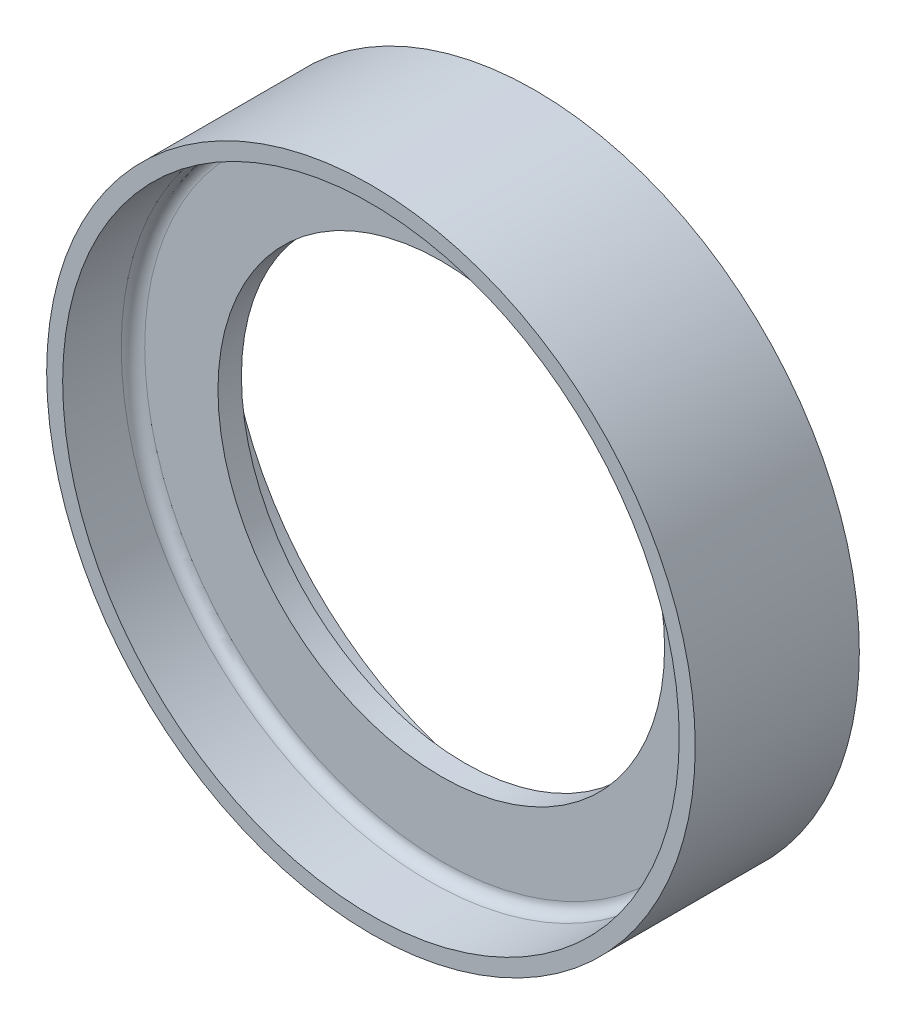
ISO-10303-21;
HEADER;
FILE_DESCRIPTION(('STEP AP214'),'2;1');
FILE_NAME('part.step','',(''),(''),'','','');
FILE_SCHEMA(('AUTOMOTIVE_DESIGN { 1 0 10303 214 1 1 1 1 }'));
ENDSEC;
DATA;
#1=APPLICATION_CONTEXT('core data for automotive mechanical design processes');
#2=APPLICATION_PROTOCOL_DEFINITION('international standard','automotive_design',2000,#1);
#3=PRODUCT_CONTEXT('',#1,'mechanical');
#4=PRODUCT('Part','Part','',(#3));
#5=PRODUCT_RELATED_PRODUCT_CATEGORY('part','',(#4));
#6=PRODUCT_DEFINITION_FORMATION('','',#4);
#7=PRODUCT_DEFINITION_CONTEXT('part definition',#1,'design');
#8=PRODUCT_DEFINITION('design','',#6,#7);
#9=PRODUCT_DEFINITION_SHAPE('','',#8);
#10=(LENGTH_UNIT() NAMED_UNIT(*) SI_UNIT(.MILLI.,.METRE.));
#11=(NAMED_UNIT(*) PLANE_ANGLE_UNIT() SI_UNIT($,.RADIAN.));
#12=(NAMED_UNIT(*) SI_UNIT($,.STERADIAN.) SOLID_ANGLE_UNIT());
#13=UNCERTAINTY_MEASURE_WITH_UNIT(LENGTH_MEASURE(1.E-05),#10,'distance_accuracy_value','');
#14=(GEOMETRIC_REPRESENTATION_CONTEXT(3) GLOBAL_UNCERTAINTY_ASSIGNED_CONTEXT((#13)) GLOBAL_UNIT_ASSIGNED_CONTEXT((#10,
#11,#12)) REPRESENTATION_CONTEXT('',''));
#15=CARTESIAN_POINT('',(0.,0.,0.));
#16=DIRECTION('',(0.,0.,1.));
#17=DIRECTION('',(1.,0.,0.));
#18=AXIS2_PLACEMENT_3D('',#15,#16,#17);
#19=CARTESIAN_POINT('',(0.,0.,1.));
#20=DIRECTION('',(0.,0.,1.));
#21=DIRECTION('',(1.,0.,0.));
#22=AXIS2_PLACEMENT_3D('',#19,#20,#21);
#23=PLANE('',#22);
#24=CARTESIAN_POINT('',(0.,0.,1.));
#25=DIRECTION('',(0.,0.,1.));
#26=DIRECTION('',(1.,0.,0.));
#27=AXIS2_PLACEMENT_3D('',#24,#25,#26);
#28=CIRCLE('',#27,12.65);
#29=CARTESIAN_POINT('',(12.65,0.,1.));
#30=VERTEX_POINT('',#29);
#31=EDGE_CURVE('E10',#30,#30,#28,.T.);
#32=ORIENTED_EDGE('',*,*,#31,.T.);
#33=EDGE_LOOP('',(#32));
#34=FACE_BOUND('',#33,.T.);
#35=CARTESIAN_POINT('',(0.,0.,1.));
#36=DIRECTION('',(0.,0.,1.));
#37=DIRECTION('',(1.,0.,0.));
#38=AXIS2_PLACEMENT_3D('',#35,#36,#37);
#39=CIRCLE('',#38,9.525);
#40=CARTESIAN_POINT('',(9.525,0.,1.));
#41=VERTEX_POINT('',#40);
#42=EDGE_CURVE('E57',#41,#41,#39,.T.);
#43=ORIENTED_EDGE('',*,*,#42,.F.);
#44=EDGE_LOOP('',(#43));
#45=FACE_BOUND('',#44,.T.);
#46=ADVANCED_FACE('F31',(#34,#45),#23,.T.);
#47=CARTESIAN_POINT('',(0.,0.,-3.));
#48=DIRECTION('',(0.,0.,1.));
#49=DIRECTION('',(1.,0.,0.));
#50=AXIS2_PLACEMENT_3D('',#47,#48,#49);
#51=CYLINDRICAL_SURFACE('',#50,13.8327);
#52=CARTESIAN_POINT('',(0.,0.,-3.));
#53=DIRECTION('',(0.,0.,1.));
#54=DIRECTION('',(1.,0.,0.));
#55=AXIS2_PLACEMENT_3D('',#52,#53,#54);
#56=CIRCLE('',#55,13.8327);
#57=CARTESIAN_POINT('',(13.8327,0.,-3.));
#58=VERTEX_POINT('',#57);
#59=EDGE_CURVE('E51',#58,#58,#56,.T.);
#60=ORIENTED_EDGE('',*,*,#59,.T.);
#61=EDGE_LOOP('',(#60));
#62=FACE_BOUND('',#61,.T.);
#63=CARTESIAN_POINT('',(0.,0.,4.));
#64=DIRECTION('',(0.,0.,1.));
#65=DIRECTION('',(1.,0.,0.));
#66=AXIS2_PLACEMENT_3D('',#63,#64,#65);
#67=CIRCLE('',#66,13.8327);
#68=CARTESIAN_POINT('',(13.8327,0.,4.));
#69=VERTEX_POINT('',#68);
#70=EDGE_CURVE('E61',#69,#69,#67,.T.);
#71=ORIENTED_EDGE('',*,*,#70,.F.);
#72=EDGE_LOOP('',(#71));
#73=FACE_BOUND('',#72,.T.);
#74=ADVANCED_FACE('F87',(#62,#73),#51,.T.);
#75=CARTESIAN_POINT('',(0.,0.,-3.));
#76=DIRECTION('',(0.,0.,1.));
#77=DIRECTION('',(1.,0.,0.));
#78=AXIS2_PLACEMENT_3D('',#75,#76,#77);
#79=PLANE('',#78);
#80=CARTESIAN_POINT('',(0.,0.,-3.));
#81=DIRECTION('',(0.,0.,1.));
#82=DIRECTION('',(1.,0.,0.));
#83=AXIS2_PLACEMENT_3D('',#80,#81,#82);
#84=CIRCLE('',#83,13.15);
#85=CARTESIAN_POINT('',(13.15,0.,-3.));
#86=VERTEX_POINT('',#85);
#87=EDGE_CURVE('E54',#86,#86,#84,.T.);
#88=ORIENTED_EDGE('',*,*,#87,.T.);
#89=EDGE_LOOP('',(#88));
#90=FACE_BOUND('',#89,.T.);
#91=ORIENTED_EDGE('',*,*,#59,.F.);
#92=EDGE_LOOP('',(#91));
#93=FACE_BOUND('',#92,.T.);
#94=ADVANCED_FACE('F92',(#90,#93),#79,.F.);
#95=CARTESIAN_POINT('',(0.,0.,-3.));
#96=DIRECTION('',(0.,0.,1.));
#97=DIRECTION('',(1.,0.,0.));
#98=AXIS2_PLACEMENT_3D('',#95,#96,#97);
#99=CYLINDRICAL_SURFACE('',#98,13.15);
#100=CARTESIAN_POINT('',(0.,0.,-0.5));
#101=DIRECTION('',(0.,0.,1.));
#102=DIRECTION('',(1.,0.,0.));
#103=AXIS2_PLACEMENT_3D('',#100,#101,#102);
#104=CIRCLE('',#103,13.15);
#105=CARTESIAN_POINT('',(13.15,0.,-0.5));
#106=VERTEX_POINT('',#105);
#107=EDGE_CURVE('E46',#106,#106,#104,.T.);
#108=ORIENTED_EDGE('',*,*,#107,.T.);
#109=EDGE_LOOP('',(#108));
#110=FACE_BOUND('',#109,.T.);
#111=ORIENTED_EDGE('',*,*,#87,.F.);
#112=EDGE_LOOP('',(#111));
#113=FACE_BOUND('',#112,.T.);
#114=ADVANCED_FACE('F99',(#110,#113),#99,.F.);
#115=CARTESIAN_POINT('',(0.,0.,0.));
#116=DIRECTION('',(0.,0.,1.));
#117=DIRECTION('',(1.,0.,0.));
#118=AXIS2_PLACEMENT_3D('',#115,#116,#117);
#119=PLANE('',#118);
#120=CARTESIAN_POINT('',(0.,0.,0.));
#121=DIRECTION('',(0.,0.,1.));
#122=DIRECTION('',(1.,0.,0.));
#123=AXIS2_PLACEMENT_3D('',#120,#121,#122);
#124=CIRCLE('',#123,12.65);
#125=CARTESIAN_POINT('',(12.65,0.,0.));
#126=VERTEX_POINT('',#125);
#127=EDGE_CURVE('E42',#126,#126,#124,.F.);
#128=ORIENTED_EDGE('',*,*,#127,.T.);
#129=EDGE_LOOP('',(#128));
#130=FACE_BOUND('',#129,.T.);
#131=CARTESIAN_POINT('',(0.,0.,0.));
#132=DIRECTION('',(0.,0.,1.));
#133=DIRECTION('',(1.,0.,0.));
#134=AXIS2_PLACEMENT_3D('',#131,#132,#133);
#135=CIRCLE('',#134,9.525);
#136=CARTESIAN_POINT('',(9.525,0.,0.));
#137=VERTEX_POINT('',#136);
#138=EDGE_CURVE('E58',#137,#137,#135,.T.);
#139=ORIENTED_EDGE('',*,*,#138,.T.);
#140=EDGE_LOOP('',(#139));
#141=FACE_BOUND('',#140,.T.);
#142=ADVANCED_FACE('F83',(#130,#141),#119,.F.);
#143=CARTESIAN_POINT('',(0.,0.,1.));
#144=DIRECTION('',(0.,0.,-1.));
#145=DIRECTION('',(-1.,0.,0.));
#146=AXIS2_PLACEMENT_3D('',#143,#144,#145);
#147=CYLINDRICAL_SURFACE('',#146,9.525);
#148=ORIENTED_EDGE('',*,*,#42,.T.);
#149=EDGE_LOOP('',(#148));
#150=FACE_BOUND('',#149,.T.);
#151=ORIENTED_EDGE('',*,*,#138,.F.);
#152=EDGE_LOOP('',(#151));
#153=FACE_BOUND('',#152,.T.);
#154=ADVANCED_FACE('F74',(#150,#153),#147,.F.);
#155=CARTESIAN_POINT('',(0.,0.,4.));
#156=DIRECTION('',(0.,0.,1.));
#157=DIRECTION('',(1.,0.,0.));
#158=AXIS2_PLACEMENT_3D('',#155,#156,#157);
#159=PLANE('',#158);
#160=ORIENTED_EDGE('',*,*,#70,.T.);
#161=EDGE_LOOP('',(#160));
#162=FACE_BOUND('',#161,.T.);
#163=CARTESIAN_POINT('',(0.,0.,4.));
#164=DIRECTION('',(0.,0.,1.));
#165=DIRECTION('',(1.,0.,0.));
#166=AXIS2_PLACEMENT_3D('',#163,#164,#165);
#167=CIRCLE('',#166,13.15);
#168=CARTESIAN_POINT('',(13.15,0.,4.));
#169=VERTEX_POINT('',#168);
#170=EDGE_CURVE('E66',#169,#169,#167,.T.);
#171=ORIENTED_EDGE('',*,*,#170,.F.);
#172=EDGE_LOOP('',(#171));
#173=FACE_BOUND('',#172,.T.);
#174=ADVANCED_FACE('F72',(#162,#173),#159,.T.);
#175=CARTESIAN_POINT('',(0.,0.,4.));
#176=DIRECTION('',(0.,0.,-1.));
#177=DIRECTION('',(-1.,0.,0.));
#178=AXIS2_PLACEMENT_3D('',#175,#176,#177);
#179=CYLINDRICAL_SURFACE('',#178,13.15);
#180=CARTESIAN_POINT('',(0.,0.,1.5));
#181=DIRECTION('',(0.,0.,1.));
#182=DIRECTION('',(1.,0.,0.));
#183=AXIS2_PLACEMENT_3D('',#180,#181,#182);
#184=CIRCLE('',#183,13.15);
#185=CARTESIAN_POINT('',(13.15,0.,1.5));
#186=VERTEX_POINT('',#185);
#187=EDGE_CURVE('E38',#186,#186,#184,.F.);
#188=ORIENTED_EDGE('',*,*,#187,.T.);
#189=EDGE_LOOP('',(#188));
#190=FACE_BOUND('',#189,.T.);
#191=ORIENTED_EDGE('',*,*,#170,.T.);
#192=EDGE_LOOP('',(#191));
#193=FACE_BOUND('',#192,.T.);
#194=ADVANCED_FACE('F70',(#190,#193),#179,.F.);
#195=CARTESIAN_POINT('',(0.,0.,-0.5));
#196=DIRECTION('',(0.,0.,1.));
#197=DIRECTION('',(1.,0.,0.));
#198=AXIS2_PLACEMENT_3D('',#195,#196,#197);
#199=TOROIDAL_SURFACE('',#198,12.65,0.5);
#200=ORIENTED_EDGE('',*,*,#127,.F.);
#201=EDGE_LOOP('',(#200));
#202=FACE_BOUND('',#201,.T.);
#203=ORIENTED_EDGE('',*,*,#107,.F.);
#204=EDGE_LOOP('',(#203));
#205=FACE_BOUND('',#204,.T.);
#206=ADVANCED_FACE('F81',(#202,#205),#199,.F.);
#207=CARTESIAN_POINT('',(0.,0.,1.5));
#208=DIRECTION('',(0.,0.,1.));
#209=DIRECTION('',(1.,0.,0.));
#210=AXIS2_PLACEMENT_3D('',#207,#208,#209);
#211=TOROIDAL_SURFACE('',#210,12.65,0.5);
#212=ORIENTED_EDGE('',*,*,#31,.F.);
#213=EDGE_LOOP('',(#212));
#214=FACE_BOUND('',#213,.T.);
#215=ORIENTED_EDGE('',*,*,#187,.F.);
#216=EDGE_LOOP('',(#215));
#217=FACE_BOUND('',#216,.T.);
#218=ADVANCED_FACE('F33',(#214,#217),#211,.F.);
#219=CLOSED_SHELL('',(#46,#74,#94,#114,#142,#154,#174,#194,#206,#218));
#220=MANIFOLD_SOLID_BREP('B2',#219);
#221=ADVANCED_BREP_SHAPE_REPRESENTATION('',(#18,#220),#14);
#222=SHAPE_DEFINITION_REPRESENTATION(#9,#221);
ENDSEC;
END-ISO-10303-21;
